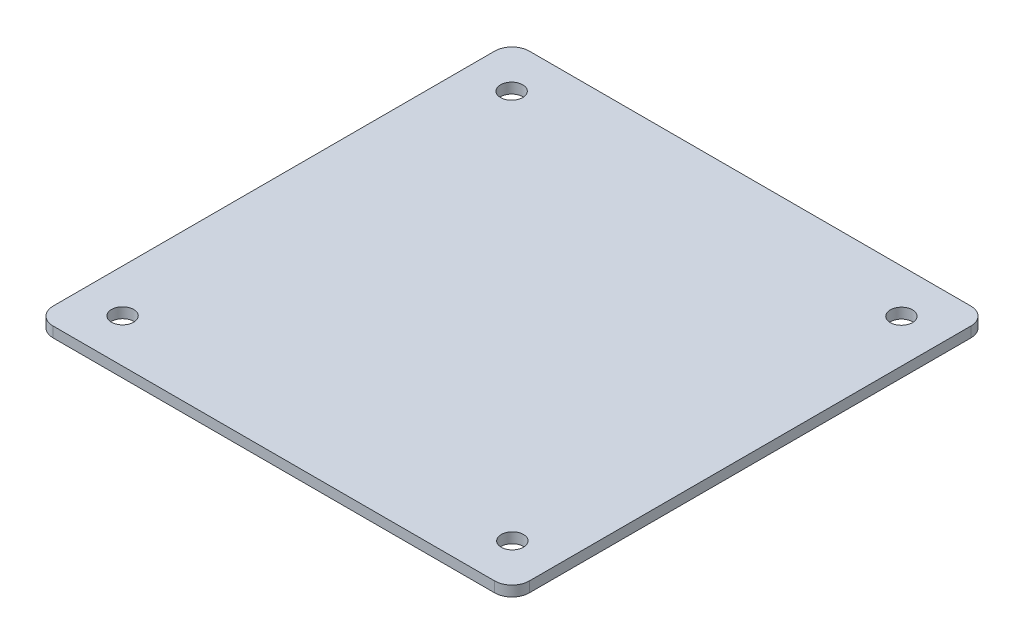
ISO-10303-21;
HEADER;
FILE_DESCRIPTION(('STEP AP214'),'2;1');
FILE_NAME('part.step','',(''),(''),'','','');
FILE_SCHEMA(('AUTOMOTIVE_DESIGN { 1 0 10303 214 1 1 1 1 }'));
ENDSEC;
DATA;
#1=APPLICATION_CONTEXT('core data for automotive mechanical design processes');
#2=APPLICATION_PROTOCOL_DEFINITION('international standard','automotive_design',2000,#1);
#3=PRODUCT_CONTEXT('',#1,'mechanical');
#4=PRODUCT('Part','Part','',(#3));
#5=PRODUCT_RELATED_PRODUCT_CATEGORY('part','',(#4));
#6=PRODUCT_DEFINITION_FORMATION('','',#4);
#7=PRODUCT_DEFINITION_CONTEXT('part definition',#1,'design');
#8=PRODUCT_DEFINITION('design','',#6,#7);
#9=PRODUCT_DEFINITION_SHAPE('','',#8);
#10=(LENGTH_UNIT() NAMED_UNIT(*) SI_UNIT(.MILLI.,.METRE.));
#11=(NAMED_UNIT(*) PLANE_ANGLE_UNIT() SI_UNIT($,.RADIAN.));
#12=(NAMED_UNIT(*) SI_UNIT($,.STERADIAN.) SOLID_ANGLE_UNIT());
#13=UNCERTAINTY_MEASURE_WITH_UNIT(LENGTH_MEASURE(1.E-05),#10,'distance_accuracy_value','');
#14=(GEOMETRIC_REPRESENTATION_CONTEXT(3) GLOBAL_UNCERTAINTY_ASSIGNED_CONTEXT((#13)) GLOBAL_UNIT_ASSIGNED_CONTEXT((#10,
#11,#12)) REPRESENTATION_CONTEXT('',''));
#15=CARTESIAN_POINT('',(0.,0.,0.));
#16=DIRECTION('',(0.,0.,1.));
#17=DIRECTION('',(1.,0.,0.));
#18=AXIS2_PLACEMENT_3D('',#15,#16,#17);
#19=CARTESIAN_POINT('',(0.,1.524,0.));
#20=DIRECTION('',(0.,-1.,0.));
#21=DIRECTION('',(0.,0.,-1.));
#22=AXIS2_PLACEMENT_3D('',#19,#20,#21);
#23=PLANE('',#22);
#24=DIRECTION('',(1.,0.,0.));
#25=VECTOR('',#24,1.);
#26=CARTESIAN_POINT('',(0.499999999999987,1.524,14.5));
#27=LINE('',#26,#25);
#28=CARTESIAN_POINT('',(3.03999999999999,1.524,14.5));
#29=VERTEX_POINT('',#28);
#30=CARTESIAN_POINT('',(67.96,1.524,14.5));
#31=VERTEX_POINT('',#30);
#32=EDGE_CURVE('E168',#29,#31,#27,.T.);
#33=ORIENTED_EDGE('',*,*,#32,.T.);
#34=CARTESIAN_POINT('',(67.96,1.524,11.96));
#35=DIRECTION('',(0.,-1.,0.));
#36=DIRECTION('',(0.,0.,-1.));
#37=AXIS2_PLACEMENT_3D('',#34,#35,#36);
#38=CIRCLE('',#37,2.54);
#39=CARTESIAN_POINT('',(70.5,1.524,11.96));
#40=VERTEX_POINT('',#39);
#41=EDGE_CURVE('E149',#31,#40,#38,.F.);
#42=ORIENTED_EDGE('',*,*,#41,.T.);
#43=DIRECTION('',(0.,0.,-1.));
#44=VECTOR('',#43,1.);
#45=CARTESIAN_POINT('',(70.5,1.524,14.5));
#46=LINE('',#45,#44);
#47=CARTESIAN_POINT('',(70.5,1.524,-52.96));
#48=VERTEX_POINT('',#47);
#49=EDGE_CURVE('E119',#40,#48,#46,.T.);
#50=ORIENTED_EDGE('',*,*,#49,.T.);
#51=CARTESIAN_POINT('',(67.96,1.524,-52.96));
#52=DIRECTION('',(0.,-1.,0.));
#53=DIRECTION('',(0.,0.,-1.));
#54=AXIS2_PLACEMENT_3D('',#51,#52,#53);
#55=CIRCLE('',#54,2.54);
#56=CARTESIAN_POINT('',(67.96,1.524,-55.5));
#57=VERTEX_POINT('',#56);
#58=EDGE_CURVE('E55',#48,#57,#55,.F.);
#59=ORIENTED_EDGE('',*,*,#58,.T.);
#60=DIRECTION('',(-1.,0.,0.));
#61=VECTOR('',#60,1.);
#62=CARTESIAN_POINT('',(0.499999999999987,1.524,-55.5));
#63=LINE('',#62,#61);
#64=CARTESIAN_POINT('',(3.03999999999999,1.524,-55.5));
#65=VERTEX_POINT('',#64);
#66=EDGE_CURVE('E135',#57,#65,#63,.T.);
#67=ORIENTED_EDGE('',*,*,#66,.T.);
#68=CARTESIAN_POINT('',(3.03999999999999,1.524,-52.96));
#69=DIRECTION('',(0.,-1.,0.));
#70=DIRECTION('',(0.,0.,-1.));
#71=AXIS2_PLACEMENT_3D('',#68,#69,#70);
#72=CIRCLE('',#71,2.54);
#73=CARTESIAN_POINT('',(0.499999999999987,1.524,-52.96));
#74=VERTEX_POINT('',#73);
#75=EDGE_CURVE('E146',#65,#74,#72,.F.);
#76=ORIENTED_EDGE('',*,*,#75,.T.);
#77=DIRECTION('',(0.,0.,1.));
#78=VECTOR('',#77,1.);
#79=CARTESIAN_POINT('',(0.499999999999987,1.524,14.5));
#80=LINE('',#79,#78);
#81=CARTESIAN_POINT('',(0.499999999999987,1.524,11.96));
#82=VERTEX_POINT('',#81);
#83=EDGE_CURVE('E129',#74,#82,#80,.T.);
#84=ORIENTED_EDGE('',*,*,#83,.T.);
#85=CARTESIAN_POINT('',(3.03999999999999,1.524,11.96));
#86=DIRECTION('',(0.,-1.,0.));
#87=DIRECTION('',(0.,0.,-1.));
#88=AXIS2_PLACEMENT_3D('',#85,#86,#87);
#89=CIRCLE('',#88,2.54);
#90=EDGE_CURVE('E144',#82,#29,#89,.F.);
#91=ORIENTED_EDGE('',*,*,#90,.T.);
#92=EDGE_LOOP('',(#33,#42,#50,#59,#67,#76,#84,#91));
#93=FACE_BOUND('',#92,.T.);
#94=CARTESIAN_POINT('',(6.84999999999999,1.524,-49.0980587750252));
#95=DIRECTION('',(0.,1.,0.));
#96=DIRECTION('',(0.,0.,1.));
#97=AXIS2_PLACEMENT_3D('',#94,#95,#96);
#98=CIRCLE('',#97,1.63195);
#99=CARTESIAN_POINT('',(6.84999999999999,1.524,-50.7300087750252));
#100=VERTEX_POINT('',#99);
#101=EDGE_CURVE('E173',#100,#100,#98,.T.);
#102=ORIENTED_EDGE('',*,*,#101,.F.);
#103=EDGE_LOOP('',(#102));
#104=FACE_BOUND('',#103,.T.);
#105=CARTESIAN_POINT('',(6.84999999999999,1.524,8.09805877502521));
#106=DIRECTION('',(0.,1.,0.));
#107=DIRECTION('',(0.,0.,-1.));
#108=AXIS2_PLACEMENT_3D('',#105,#106,#107);
#109=CIRCLE('',#108,1.63195);
#110=CARTESIAN_POINT('',(6.84999999999999,1.524,6.46610877502521));
#111=VERTEX_POINT('',#110);
#112=EDGE_CURVE('E182',#111,#111,#109,.T.);
#113=ORIENTED_EDGE('',*,*,#112,.F.);
#114=EDGE_LOOP('',(#113));
#115=FACE_BOUND('',#114,.T.);
#116=CARTESIAN_POINT('',(64.15,1.524,8.09805877502521));
#117=DIRECTION('',(0.,1.,0.));
#118=DIRECTION('',(0.,0.,1.));
#119=AXIS2_PLACEMENT_3D('',#116,#117,#118);
#120=CIRCLE('',#119,1.63194999999999);
#121=CARTESIAN_POINT('',(64.15,1.524,6.46610877502522));
#122=VERTEX_POINT('',#121);
#123=EDGE_CURVE('E187',#122,#122,#120,.T.);
#124=ORIENTED_EDGE('',*,*,#123,.F.);
#125=EDGE_LOOP('',(#124));
#126=FACE_BOUND('',#125,.T.);
#127=CARTESIAN_POINT('',(64.15,1.524,-49.0980587750252));
#128=DIRECTION('',(0.,1.,0.));
#129=DIRECTION('',(0.,0.,-1.));
#130=AXIS2_PLACEMENT_3D('',#127,#128,#129);
#131=CIRCLE('',#130,1.63194999999999);
#132=CARTESIAN_POINT('',(64.15,1.524,-50.7300087750252));
#133=VERTEX_POINT('',#132);
#134=EDGE_CURVE('E193',#133,#133,#131,.T.);
#135=ORIENTED_EDGE('',*,*,#134,.F.);
#136=EDGE_LOOP('',(#135));
#137=FACE_BOUND('',#136,.T.);
#138=ADVANCED_FACE('F33',(#93,#104,#115,#126,#137),#23,.F.);
#139=CARTESIAN_POINT('',(0.,0.,0.));
#140=DIRECTION('',(0.,-1.,0.));
#141=DIRECTION('',(0.,0.,-1.));
#142=AXIS2_PLACEMENT_3D('',#139,#140,#141);
#143=PLANE('',#142);
#144=CARTESIAN_POINT('',(64.15,0.,8.09805877502521));
#145=DIRECTION('',(0.,1.,0.));
#146=DIRECTION('',(0.,0.,1.));
#147=AXIS2_PLACEMENT_3D('',#144,#145,#146);
#148=CIRCLE('',#147,1.63194999999999);
#149=CARTESIAN_POINT('',(64.15,0.,6.46610877502522));
#150=VERTEX_POINT('',#149);
#151=EDGE_CURVE('E190',#150,#150,#148,.T.);
#152=ORIENTED_EDGE('',*,*,#151,.T.);
#153=EDGE_LOOP('',(#152));
#154=FACE_BOUND('',#153,.T.);
#155=CARTESIAN_POINT('',(6.84999999999999,0.,-49.0980587750252));
#156=DIRECTION('',(0.,1.,0.));
#157=DIRECTION('',(0.,0.,1.));
#158=AXIS2_PLACEMENT_3D('',#155,#156,#157);
#159=CIRCLE('',#158,1.63195);
#160=CARTESIAN_POINT('',(6.84999999999999,0.,-50.7300087750252));
#161=VERTEX_POINT('',#160);
#162=EDGE_CURVE('E175',#161,#161,#159,.T.);
#163=ORIENTED_EDGE('',*,*,#162,.T.);
#164=EDGE_LOOP('',(#163));
#165=FACE_BOUND('',#164,.T.);
#166=DIRECTION('',(0.,0.,-1.));
#167=VECTOR('',#166,1.);
#168=CARTESIAN_POINT('',(70.5,0.,14.5));
#169=LINE('',#168,#167);
#170=CARTESIAN_POINT('',(70.5,0.,11.96));
#171=VERTEX_POINT('',#170);
#172=CARTESIAN_POINT('',(70.5,0.,-52.96));
#173=VERTEX_POINT('',#172);
#174=EDGE_CURVE('E117',#171,#173,#169,.T.);
#175=ORIENTED_EDGE('',*,*,#174,.F.);
#176=CARTESIAN_POINT('',(67.96,0.,11.96));
#177=DIRECTION('',(0.,-1.,0.));
#178=DIRECTION('',(0.,0.,-1.));
#179=AXIS2_PLACEMENT_3D('',#176,#177,#178);
#180=CIRCLE('',#179,2.54);
#181=CARTESIAN_POINT('',(67.96,0.,14.5));
#182=VERTEX_POINT('',#181);
#183=EDGE_CURVE('E100',#171,#182,#180,.T.);
#184=ORIENTED_EDGE('',*,*,#183,.T.);
#185=DIRECTION('',(1.,0.,0.));
#186=VECTOR('',#185,1.);
#187=CARTESIAN_POINT('',(0.499999999999987,0.,14.5));
#188=LINE('',#187,#186);
#189=CARTESIAN_POINT('',(3.03999999999999,0.,14.5));
#190=VERTEX_POINT('',#189);
#191=EDGE_CURVE('E127',#190,#182,#188,.T.);
#192=ORIENTED_EDGE('',*,*,#191,.F.);
#193=CARTESIAN_POINT('',(3.03999999999999,0.,11.96));
#194=DIRECTION('',(0.,-1.,0.));
#195=DIRECTION('',(0.,0.,-1.));
#196=AXIS2_PLACEMENT_3D('',#193,#194,#195);
#197=CIRCLE('',#196,2.54);
#198=CARTESIAN_POINT('',(0.499999999999987,0.,11.96));
#199=VERTEX_POINT('',#198);
#200=EDGE_CURVE('E120',#190,#199,#197,.T.);
#201=ORIENTED_EDGE('',*,*,#200,.T.);
#202=DIRECTION('',(0.,0.,1.));
#203=VECTOR('',#202,1.);
#204=CARTESIAN_POINT('',(0.499999999999987,0.,14.5));
#205=LINE('',#204,#203);
#206=CARTESIAN_POINT('',(0.499999999999987,0.,-52.96));
#207=VERTEX_POINT('',#206);
#208=EDGE_CURVE('E131',#207,#199,#205,.T.);
#209=ORIENTED_EDGE('',*,*,#208,.F.);
#210=CARTESIAN_POINT('',(3.03999999999999,0.,-52.96));
#211=DIRECTION('',(0.,-1.,0.));
#212=DIRECTION('',(0.,0.,-1.));
#213=AXIS2_PLACEMENT_3D('',#210,#211,#212);
#214=CIRCLE('',#213,2.54);
#215=CARTESIAN_POINT('',(3.03999999999999,0.,-55.5));
#216=VERTEX_POINT('',#215);
#217=EDGE_CURVE('E138',#207,#216,#214,.T.);
#218=ORIENTED_EDGE('',*,*,#217,.T.);
#219=DIRECTION('',(-1.,0.,0.));
#220=VECTOR('',#219,1.);
#221=CARTESIAN_POINT('',(0.499999999999987,0.,-55.5));
#222=LINE('',#221,#220);
#223=CARTESIAN_POINT('',(67.96,0.,-55.5));
#224=VERTEX_POINT('',#223);
#225=EDGE_CURVE('E126',#224,#216,#222,.T.);
#226=ORIENTED_EDGE('',*,*,#225,.F.);
#227=CARTESIAN_POINT('',(67.96,0.,-52.96));
#228=DIRECTION('',(0.,-1.,0.));
#229=DIRECTION('',(0.,0.,-1.));
#230=AXIS2_PLACEMENT_3D('',#227,#228,#229);
#231=CIRCLE('',#230,2.54);
#232=EDGE_CURVE('E111',#224,#173,#231,.T.);
#233=ORIENTED_EDGE('',*,*,#232,.T.);
#234=EDGE_LOOP('',(#175,#184,#192,#201,#209,#218,#226,#233));
#235=FACE_BOUND('',#234,.T.);
#236=CARTESIAN_POINT('',(6.84999999999999,0.,8.09805877502521));
#237=DIRECTION('',(0.,1.,0.));
#238=DIRECTION('',(0.,0.,-1.));
#239=AXIS2_PLACEMENT_3D('',#236,#237,#238);
#240=CIRCLE('',#239,1.63195);
#241=CARTESIAN_POINT('',(6.84999999999999,0.,6.46610877502521));
#242=VERTEX_POINT('',#241);
#243=EDGE_CURVE('E184',#242,#242,#240,.T.);
#244=ORIENTED_EDGE('',*,*,#243,.T.);
#245=EDGE_LOOP('',(#244));
#246=FACE_BOUND('',#245,.T.);
#247=CARTESIAN_POINT('',(64.15,0.,-49.0980587750252));
#248=DIRECTION('',(0.,1.,0.));
#249=DIRECTION('',(0.,0.,-1.));
#250=AXIS2_PLACEMENT_3D('',#247,#248,#249);
#251=CIRCLE('',#250,1.63194999999999);
#252=CARTESIAN_POINT('',(64.15,0.,-50.7300087750252));
#253=VERTEX_POINT('',#252);
#254=EDGE_CURVE('E196',#253,#253,#251,.T.);
#255=ORIENTED_EDGE('',*,*,#254,.T.);
#256=EDGE_LOOP('',(#255));
#257=FACE_BOUND('',#256,.T.);
#258=ADVANCED_FACE('F123',(#154,#165,#235,#246,#257),#143,.T.);
#259=CARTESIAN_POINT('',(0.499999999999987,1.524,14.5));
#260=DIRECTION('',(1.,0.,0.));
#261=DIRECTION('',(0.,0.,-1.));
#262=AXIS2_PLACEMENT_3D('',#259,#260,#261);
#263=PLANE('',#262);
#264=ORIENTED_EDGE('',*,*,#83,.F.);
#265=DIRECTION('',(0.,-1.,0.));
#266=VECTOR('',#265,1.);
#267=CARTESIAN_POINT('',(0.499999999999987,1.524,-52.96));
#268=LINE('',#267,#266);
#269=EDGE_CURVE('E11',#74,#207,#268,.T.);
#270=ORIENTED_EDGE('',*,*,#269,.T.);
#271=ORIENTED_EDGE('',*,*,#208,.T.);
#272=DIRECTION('',(0.,-1.,0.));
#273=VECTOR('',#272,1.);
#274=CARTESIAN_POINT('',(0.499999999999987,1.524,11.96));
#275=LINE('',#274,#273);
#276=EDGE_CURVE('E41',#199,#82,#275,.F.);
#277=ORIENTED_EDGE('',*,*,#276,.T.);
#278=EDGE_LOOP('',(#264,#270,#271,#277));
#279=FACE_BOUND('',#278,.T.);
#280=ADVANCED_FACE('F159',(#279),#263,.F.);
#281=CARTESIAN_POINT('',(0.499999999999987,1.524,14.5));
#282=DIRECTION('',(0.,0.,-1.));
#283=DIRECTION('',(-1.,0.,0.));
#284=AXIS2_PLACEMENT_3D('',#281,#282,#283);
#285=PLANE('',#284);
#286=ORIENTED_EDGE('',*,*,#191,.T.);
#287=DIRECTION('',(0.,-1.,0.));
#288=VECTOR('',#287,1.);
#289=CARTESIAN_POINT('',(67.96,1.524,14.5));
#290=LINE('',#289,#288);
#291=EDGE_CURVE('E105',#182,#31,#290,.F.);
#292=ORIENTED_EDGE('',*,*,#291,.T.);
#293=ORIENTED_EDGE('',*,*,#32,.F.);
#294=DIRECTION('',(0.,-1.,0.));
#295=VECTOR('',#294,1.);
#296=CARTESIAN_POINT('',(3.03999999999999,1.524,14.5));
#297=LINE('',#296,#295);
#298=EDGE_CURVE('E110',#29,#190,#297,.T.);
#299=ORIENTED_EDGE('',*,*,#298,.T.);
#300=EDGE_LOOP('',(#286,#292,#293,#299));
#301=FACE_BOUND('',#300,.T.);
#302=ADVANCED_FACE('F172',(#301),#285,.F.);
#303=CARTESIAN_POINT('',(70.5,1.524,14.5));
#304=DIRECTION('',(-1.,0.,0.));
#305=DIRECTION('',(0.,0.,1.));
#306=AXIS2_PLACEMENT_3D('',#303,#304,#305);
#307=PLANE('',#306);
#308=ORIENTED_EDGE('',*,*,#49,.F.);
#309=DIRECTION('',(0.,-1.,0.));
#310=VECTOR('',#309,1.);
#311=CARTESIAN_POINT('',(70.5,1.524,11.96));
#312=LINE('',#311,#310);
#313=EDGE_CURVE('E104',#40,#171,#312,.T.);
#314=ORIENTED_EDGE('',*,*,#313,.T.);
#315=ORIENTED_EDGE('',*,*,#174,.T.);
#316=DIRECTION('',(0.,-1.,0.));
#317=VECTOR('',#316,1.);
#318=CARTESIAN_POINT('',(70.5,1.524,-52.96));
#319=LINE('',#318,#317);
#320=EDGE_CURVE('E121',#173,#48,#319,.F.);
#321=ORIENTED_EDGE('',*,*,#320,.T.);
#322=EDGE_LOOP('',(#308,#314,#315,#321));
#323=FACE_BOUND('',#322,.T.);
#324=ADVANCED_FACE('F116',(#323),#307,.F.);
#325=CARTESIAN_POINT('',(0.499999999999987,1.524,-55.5));
#326=DIRECTION('',(0.,0.,1.));
#327=DIRECTION('',(1.,0.,0.));
#328=AXIS2_PLACEMENT_3D('',#325,#326,#327);
#329=PLANE('',#328);
#330=ORIENTED_EDGE('',*,*,#66,.F.);
#331=DIRECTION('',(0.,-1.,0.));
#332=VECTOR('',#331,1.);
#333=CARTESIAN_POINT('',(67.96,1.524,-55.5));
#334=LINE('',#333,#332);
#335=EDGE_CURVE('E152',#57,#224,#334,.T.);
#336=ORIENTED_EDGE('',*,*,#335,.T.);
#337=ORIENTED_EDGE('',*,*,#225,.T.);
#338=DIRECTION('',(0.,-1.,0.));
#339=VECTOR('',#338,1.);
#340=CARTESIAN_POINT('',(3.03999999999999,1.524,-55.5));
#341=LINE('',#340,#339);
#342=EDGE_CURVE('E48',#216,#65,#341,.F.);
#343=ORIENTED_EDGE('',*,*,#342,.T.);
#344=EDGE_LOOP('',(#330,#336,#337,#343));
#345=FACE_BOUND('',#344,.T.);
#346=ADVANCED_FACE('F216',(#345),#329,.F.);
#347=CARTESIAN_POINT('',(6.84999999999999,1.524,-49.0980587750252));
#348=DIRECTION('',(0.,-1.,0.));
#349=DIRECTION('',(0.,0.,-1.));
#350=AXIS2_PLACEMENT_3D('',#347,#348,#349);
#351=CYLINDRICAL_SURFACE('',#350,1.63195);
#352=CARTESIAN_POINT('',(6.84999999999999,1.524,-50.7300087750252));
#353=CARTESIAN_POINT('',(6.84999999999999,1.508125,-50.7300087750252));
#354=CARTESIAN_POINT('',(6.84999999999999,1.49225,-50.7300087750252));
#355=CARTESIAN_POINT('',(6.84999999999999,1.4605,-50.7300087750252));
#356=CARTESIAN_POINT('',(6.84999999999999,1.444625,-50.7300087750252));
#357=CARTESIAN_POINT('',(6.84999999999999,1.412875,-50.7300087750252));
#358=CARTESIAN_POINT('',(6.84999999999999,1.397,-50.7300087750252));
#359=CARTESIAN_POINT('',(6.84999999999999,1.36525,-50.7300087750252));
#360=CARTESIAN_POINT('',(6.84999999999999,1.349375,-50.7300087750252));
#361=CARTESIAN_POINT('',(6.84999999999999,1.317625,-50.7300087750252));
#362=CARTESIAN_POINT('',(6.84999999999999,1.30175,-50.7300087750252));
#363=CARTESIAN_POINT('',(6.84999999999999,1.27,-50.7300087750252));
#364=CARTESIAN_POINT('',(6.84999999999999,1.254125,-50.7300087750252));
#365=CARTESIAN_POINT('',(6.84999999999999,1.222375,-50.7300087750252));
#366=CARTESIAN_POINT('',(6.84999999999999,1.2065,-50.7300087750252));
#367=CARTESIAN_POINT('',(6.84999999999999,1.17475,-50.7300087750252));
#368=CARTESIAN_POINT('',(6.84999999999999,1.158875,-50.7300087750252));
#369=CARTESIAN_POINT('',(6.84999999999999,1.127125,-50.7300087750252));
#370=CARTESIAN_POINT('',(6.84999999999999,1.11125,-50.7300087750252));
#371=CARTESIAN_POINT('',(6.84999999999999,1.0795,-50.7300087750252));
#372=CARTESIAN_POINT('',(6.84999999999999,1.063625,-50.7300087750252));
#373=CARTESIAN_POINT('',(6.84999999999999,1.031875,-50.7300087750252));
#374=CARTESIAN_POINT('',(6.84999999999999,1.016,-50.7300087750252));
#375=CARTESIAN_POINT('',(6.84999999999999,0.98425,-50.7300087750252));
#376=CARTESIAN_POINT('',(6.84999999999999,0.968375,-50.7300087750252));
#377=CARTESIAN_POINT('',(6.84999999999999,0.936625,-50.7300087750252));
#378=CARTESIAN_POINT('',(6.84999999999999,0.92075,-50.7300087750252));
#379=CARTESIAN_POINT('',(6.84999999999999,0.889,-50.7300087750252));
#380=CARTESIAN_POINT('',(6.84999999999999,0.873125,-50.7300087750252));
#381=CARTESIAN_POINT('',(6.84999999999999,0.841375,-50.7300087750252));
#382=CARTESIAN_POINT('',(6.84999999999999,0.8255,-50.7300087750252));
#383=CARTESIAN_POINT('',(6.84999999999999,0.79375,-50.7300087750252));
#384=CARTESIAN_POINT('',(6.84999999999999,0.777875,-50.7300087750252));
#385=CARTESIAN_POINT('',(6.84999999999999,0.746125,-50.7300087750252));
#386=CARTESIAN_POINT('',(6.84999999999999,0.73025,-50.7300087750252));
#387=CARTESIAN_POINT('',(6.84999999999999,0.6985,-50.7300087750252));
#388=CARTESIAN_POINT('',(6.84999999999999,0.682625,-50.7300087750252));
#389=CARTESIAN_POINT('',(6.84999999999999,0.650875,-50.7300087750252));
#390=CARTESIAN_POINT('',(6.84999999999999,0.635,-50.7300087750252));
#391=CARTESIAN_POINT('',(6.84999999999999,0.60325,-50.7300087750252));
#392=CARTESIAN_POINT('',(6.84999999999999,0.587375,-50.7300087750252));
#393=CARTESIAN_POINT('',(6.84999999999999,0.555625,-50.7300087750252));
#394=CARTESIAN_POINT('',(6.84999999999999,0.53975,-50.7300087750252));
#395=CARTESIAN_POINT('',(6.84999999999999,0.508,-50.7300087750252));
#396=CARTESIAN_POINT('',(6.84999999999999,0.492125,-50.7300087750252));
#397=CARTESIAN_POINT('',(6.84999999999999,0.460375,-50.7300087750252));
#398=CARTESIAN_POINT('',(6.84999999999999,0.4445,-50.7300087750252));
#399=CARTESIAN_POINT('',(6.84999999999999,0.41275,-50.7300087750252));
#400=CARTESIAN_POINT('',(6.84999999999999,0.396875,-50.7300087750252));
#401=CARTESIAN_POINT('',(6.84999999999999,0.365125,-50.7300087750252));
#402=CARTESIAN_POINT('',(6.84999999999999,0.34925,-50.7300087750252));
#403=CARTESIAN_POINT('',(6.84999999999999,0.3175,-50.7300087750252));
#404=CARTESIAN_POINT('',(6.84999999999999,0.301625,-50.7300087750252));
#405=CARTESIAN_POINT('',(6.84999999999999,0.269875,-50.7300087750252));
#406=CARTESIAN_POINT('',(6.84999999999999,0.254,-50.7300087750252));
#407=CARTESIAN_POINT('',(6.84999999999999,0.22225,-50.7300087750252));
#408=CARTESIAN_POINT('',(6.84999999999999,0.206375,-50.7300087750252));
#409=CARTESIAN_POINT('',(6.84999999999999,0.174625,-50.7300087750252));
#410=CARTESIAN_POINT('',(6.84999999999999,0.15875,-50.7300087750252));
#411=CARTESIAN_POINT('',(6.84999999999999,0.127,-50.7300087750252));
#412=CARTESIAN_POINT('',(6.84999999999999,0.111125,-50.7300087750252));
#413=CARTESIAN_POINT('',(6.84999999999999,0.079375,-50.7300087750252));
#414=CARTESIAN_POINT('',(6.84999999999999,0.0635,-50.7300087750252));
#415=CARTESIAN_POINT('',(6.84999999999999,0.0317499999999999,-50.7300087750252));
#416=CARTESIAN_POINT('',(6.84999999999999,0.015875,-50.7300087750252));
#417=CARTESIAN_POINT('',(6.84999999999999,0.,-50.7300087750252));
#418=B_SPLINE_CURVE_WITH_KNOTS('',3,(#352,#353,#354,#355,#356,#357,#358,#359,#360,#361,#362,
#363,#364,#365,#366,#367,#368,#369,#370,#371,#372,#373,#374,#375,#376,#377,#378,#379,#380,#381,
#382,#383,#384,#385,#386,#387,#388,#389,#390,#391,#392,#393,#394,#395,#396,#397,#398,#399,#400,
#401,#402,#403,#404,#405,#406,#407,#408,#409,#410,#411,#412,#413,#414,#415,#416,#417),
.UNSPECIFIED.,.F.,.F.,(4,2,2,2,2,2,2,2,2,2,2,2,2,2,2,2,2,2,2,2,2,2,2,2,2,2,2,2,2,2,2,2,4),(0.,
0.0476250000000001,0.0952500000000001,0.142875,0.1905,0.238125,0.28575,0.333375,0.381,0.428625,
0.47625,0.523875,0.5715,0.619125,0.66675,0.714375,0.762,0.809625,0.85725,0.904875,0.9525,
1.000125,1.04775,1.095375,1.143,1.190625,1.23825,1.285875,1.3335,1.381125,1.42875,1.476375,
1.524),.UNSPECIFIED.);
#419=EDGE_CURVE('BSEAM213',#100,#161,#418,.T.);
#420=ORIENTED_EDGE('',*,*,#101,.T.);
#421=ORIENTED_EDGE('',*,*,#162,.F.);
#422=ORIENTED_EDGE('',*,*,#419,.T.);
#423=ORIENTED_EDGE('',*,*,#419,.F.);
#424=EDGE_LOOP('',(#420,#422,#421,#423));
#425=FACE_BOUND('',#424,.T.);
#426=ADVANCED_FACE('F213',(#425),#351,.F.);
#427=CARTESIAN_POINT('',(6.84999999999999,1.524,8.09805877502521));
#428=DIRECTION('',(0.,-1.,0.));
#429=DIRECTION('',(0.,0.,-1.));
#430=AXIS2_PLACEMENT_3D('',#427,#428,#429);
#431=CYLINDRICAL_SURFACE('',#430,1.63195);
#432=CARTESIAN_POINT('',(6.84999999999999,1.524,6.46610877502521));
#433=CARTESIAN_POINT('',(6.84999999999999,1.508125,6.46610877502521));
#434=CARTESIAN_POINT('',(6.84999999999999,1.49225,6.46610877502521));
#435=CARTESIAN_POINT('',(6.84999999999999,1.4605,6.46610877502521));
#436=CARTESIAN_POINT('',(6.84999999999999,1.444625,6.46610877502521));
#437=CARTESIAN_POINT('',(6.84999999999999,1.412875,6.46610877502521));
#438=CARTESIAN_POINT('',(6.84999999999999,1.397,6.46610877502521));
#439=CARTESIAN_POINT('',(6.84999999999999,1.36525,6.46610877502521));
#440=CARTESIAN_POINT('',(6.84999999999999,1.349375,6.46610877502521));
#441=CARTESIAN_POINT('',(6.84999999999999,1.317625,6.46610877502521));
#442=CARTESIAN_POINT('',(6.84999999999999,1.30175,6.46610877502521));
#443=CARTESIAN_POINT('',(6.84999999999999,1.27,6.46610877502521));
#444=CARTESIAN_POINT('',(6.84999999999999,1.254125,6.46610877502521));
#445=CARTESIAN_POINT('',(6.84999999999999,1.222375,6.46610877502521));
#446=CARTESIAN_POINT('',(6.84999999999999,1.2065,6.46610877502521));
#447=CARTESIAN_POINT('',(6.84999999999999,1.17475,6.46610877502521));
#448=CARTESIAN_POINT('',(6.84999999999999,1.158875,6.46610877502521));
#449=CARTESIAN_POINT('',(6.84999999999999,1.127125,6.46610877502521));
#450=CARTESIAN_POINT('',(6.84999999999999,1.11125,6.46610877502521));
#451=CARTESIAN_POINT('',(6.84999999999999,1.0795,6.46610877502521));
#452=CARTESIAN_POINT('',(6.84999999999999,1.063625,6.46610877502521));
#453=CARTESIAN_POINT('',(6.84999999999999,1.031875,6.46610877502521));
#454=CARTESIAN_POINT('',(6.84999999999999,1.016,6.46610877502521));
#455=CARTESIAN_POINT('',(6.84999999999999,0.98425,6.46610877502521));
#456=CARTESIAN_POINT('',(6.84999999999999,0.968375,6.46610877502521));
#457=CARTESIAN_POINT('',(6.84999999999999,0.936625,6.46610877502521));
#458=CARTESIAN_POINT('',(6.84999999999999,0.92075,6.46610877502521));
#459=CARTESIAN_POINT('',(6.84999999999999,0.889,6.46610877502521));
#460=CARTESIAN_POINT('',(6.84999999999999,0.873125,6.46610877502521));
#461=CARTESIAN_POINT('',(6.84999999999999,0.841375,6.46610877502521));
#462=CARTESIAN_POINT('',(6.84999999999999,0.8255,6.46610877502521));
#463=CARTESIAN_POINT('',(6.84999999999999,0.79375,6.46610877502521));
#464=CARTESIAN_POINT('',(6.84999999999999,0.777875,6.46610877502521));
#465=CARTESIAN_POINT('',(6.84999999999999,0.746125,6.46610877502521));
#466=CARTESIAN_POINT('',(6.84999999999999,0.73025,6.46610877502521));
#467=CARTESIAN_POINT('',(6.84999999999999,0.6985,6.46610877502521));
#468=CARTESIAN_POINT('',(6.84999999999999,0.682625,6.46610877502521));
#469=CARTESIAN_POINT('',(6.84999999999999,0.650875,6.46610877502521));
#470=CARTESIAN_POINT('',(6.84999999999999,0.635,6.46610877502521));
#471=CARTESIAN_POINT('',(6.84999999999999,0.60325,6.46610877502521));
#472=CARTESIAN_POINT('',(6.84999999999999,0.587375,6.46610877502521));
#473=CARTESIAN_POINT('',(6.84999999999999,0.555625,6.46610877502521));
#474=CARTESIAN_POINT('',(6.84999999999999,0.53975,6.46610877502521));
#475=CARTESIAN_POINT('',(6.84999999999999,0.508,6.46610877502521));
#476=CARTESIAN_POINT('',(6.84999999999999,0.492125,6.46610877502521));
#477=CARTESIAN_POINT('',(6.84999999999999,0.460375,6.46610877502521));
#478=CARTESIAN_POINT('',(6.84999999999999,0.4445,6.46610877502521));
#479=CARTESIAN_POINT('',(6.84999999999999,0.41275,6.46610877502521));
#480=CARTESIAN_POINT('',(6.84999999999999,0.396875,6.46610877502521));
#481=CARTESIAN_POINT('',(6.84999999999999,0.365125,6.46610877502521));
#482=CARTESIAN_POINT('',(6.84999999999999,0.34925,6.46610877502521));
#483=CARTESIAN_POINT('',(6.84999999999999,0.3175,6.46610877502521));
#484=CARTESIAN_POINT('',(6.84999999999999,0.301625,6.46610877502521));
#485=CARTESIAN_POINT('',(6.84999999999999,0.269875,6.46610877502521));
#486=CARTESIAN_POINT('',(6.84999999999999,0.254,6.46610877502521));
#487=CARTESIAN_POINT('',(6.84999999999999,0.22225,6.46610877502521));
#488=CARTESIAN_POINT('',(6.84999999999999,0.206375,6.46610877502521));
#489=CARTESIAN_POINT('',(6.84999999999999,0.174625,6.46610877502521));
#490=CARTESIAN_POINT('',(6.84999999999999,0.15875,6.46610877502521));
#491=CARTESIAN_POINT('',(6.84999999999999,0.127,6.46610877502521));
#492=CARTESIAN_POINT('',(6.84999999999999,0.111125,6.46610877502521));
#493=CARTESIAN_POINT('',(6.84999999999999,0.079375,6.46610877502521));
#494=CARTESIAN_POINT('',(6.84999999999999,0.0635,6.46610877502521));
#495=CARTESIAN_POINT('',(6.84999999999999,0.0317499999999999,6.46610877502521));
#496=CARTESIAN_POINT('',(6.84999999999999,0.015875,6.46610877502521));
#497=CARTESIAN_POINT('',(6.84999999999999,0.,6.46610877502521));
#498=B_SPLINE_CURVE_WITH_KNOTS('',3,(#432,#433,#434,#435,#436,#437,#438,#439,#440,#441,#442,
#443,#444,#445,#446,#447,#448,#449,#450,#451,#452,#453,#454,#455,#456,#457,#458,#459,#460,#461,
#462,#463,#464,#465,#466,#467,#468,#469,#470,#471,#472,#473,#474,#475,#476,#477,#478,#479,#480,
#481,#482,#483,#484,#485,#486,#487,#488,#489,#490,#491,#492,#493,#494,#495,#496,#497),
.UNSPECIFIED.,.F.,.F.,(4,2,2,2,2,2,2,2,2,2,2,2,2,2,2,2,2,2,2,2,2,2,2,2,2,2,2,2,2,2,2,2,4),(0.,
0.0476250000000001,0.0952500000000001,0.142875,0.1905,0.238125,0.28575,0.333375,0.381,0.428625,
0.47625,0.523875,0.5715,0.619125,0.66675,0.714375,0.762,0.809625,0.85725,0.904875,0.9525,
1.000125,1.04775,1.095375,1.143,1.190625,1.23825,1.285875,1.3335,1.381125,1.42875,1.476375,
1.524),.UNSPECIFIED.);
#499=EDGE_CURVE('BSEAM308',#111,#242,#498,.T.);
#500=ORIENTED_EDGE('',*,*,#112,.T.);
#501=ORIENTED_EDGE('',*,*,#243,.F.);
#502=ORIENTED_EDGE('',*,*,#499,.T.);
#503=ORIENTED_EDGE('',*,*,#499,.F.);
#504=EDGE_LOOP('',(#500,#502,#501,#503));
#505=FACE_BOUND('',#504,.T.);
#506=ADVANCED_FACE('F308',(#505),#431,.F.);
#507=CARTESIAN_POINT('',(64.15,1.524,8.09805877502521));
#508=DIRECTION('',(0.,-1.,0.));
#509=DIRECTION('',(0.,0.,-1.));
#510=AXIS2_PLACEMENT_3D('',#507,#508,#509);
#511=CYLINDRICAL_SURFACE('',#510,1.63194999999999);
#512=CARTESIAN_POINT('',(64.15,1.524,6.46610877502522));
#513=CARTESIAN_POINT('',(64.15,1.508125,6.46610877502522));
#514=CARTESIAN_POINT('',(64.15,1.49225,6.46610877502522));
#515=CARTESIAN_POINT('',(64.15,1.4605,6.46610877502522));
#516=CARTESIAN_POINT('',(64.15,1.444625,6.46610877502522));
#517=CARTESIAN_POINT('',(64.15,1.412875,6.46610877502522));
#518=CARTESIAN_POINT('',(64.15,1.397,6.46610877502522));
#519=CARTESIAN_POINT('',(64.15,1.36525,6.46610877502522));
#520=CARTESIAN_POINT('',(64.15,1.349375,6.46610877502522));
#521=CARTESIAN_POINT('',(64.15,1.317625,6.46610877502522));
#522=CARTESIAN_POINT('',(64.15,1.30175,6.46610877502522));
#523=CARTESIAN_POINT('',(64.15,1.27,6.46610877502522));
#524=CARTESIAN_POINT('',(64.15,1.254125,6.46610877502522));
#525=CARTESIAN_POINT('',(64.15,1.222375,6.46610877502522));
#526=CARTESIAN_POINT('',(64.15,1.2065,6.46610877502522));
#527=CARTESIAN_POINT('',(64.15,1.17475,6.46610877502522));
#528=CARTESIAN_POINT('',(64.15,1.158875,6.46610877502522));
#529=CARTESIAN_POINT('',(64.15,1.127125,6.46610877502522));
#530=CARTESIAN_POINT('',(64.15,1.11125,6.46610877502522));
#531=CARTESIAN_POINT('',(64.15,1.0795,6.46610877502522));
#532=CARTESIAN_POINT('',(64.15,1.063625,6.46610877502522));
#533=CARTESIAN_POINT('',(64.15,1.031875,6.46610877502522));
#534=CARTESIAN_POINT('',(64.15,1.016,6.46610877502522));
#535=CARTESIAN_POINT('',(64.15,0.98425,6.46610877502522));
#536=CARTESIAN_POINT('',(64.15,0.968375,6.46610877502522));
#537=CARTESIAN_POINT('',(64.15,0.936625,6.46610877502522));
#538=CARTESIAN_POINT('',(64.15,0.92075,6.46610877502522));
#539=CARTESIAN_POINT('',(64.15,0.889,6.46610877502522));
#540=CARTESIAN_POINT('',(64.15,0.873125,6.46610877502522));
#541=CARTESIAN_POINT('',(64.15,0.841375,6.46610877502522));
#542=CARTESIAN_POINT('',(64.15,0.8255,6.46610877502522));
#543=CARTESIAN_POINT('',(64.15,0.79375,6.46610877502522));
#544=CARTESIAN_POINT('',(64.15,0.777875,6.46610877502522));
#545=CARTESIAN_POINT('',(64.15,0.746125,6.46610877502522));
#546=CARTESIAN_POINT('',(64.15,0.73025,6.46610877502522));
#547=CARTESIAN_POINT('',(64.15,0.6985,6.46610877502522));
#548=CARTESIAN_POINT('',(64.15,0.682625,6.46610877502522));
#549=CARTESIAN_POINT('',(64.15,0.650875,6.46610877502522));
#550=CARTESIAN_POINT('',(64.15,0.635,6.46610877502522));
#551=CARTESIAN_POINT('',(64.15,0.60325,6.46610877502522));
#552=CARTESIAN_POINT('',(64.15,0.587375,6.46610877502522));
#553=CARTESIAN_POINT('',(64.15,0.555625,6.46610877502522));
#554=CARTESIAN_POINT('',(64.15,0.53975,6.46610877502522));
#555=CARTESIAN_POINT('',(64.15,0.508,6.46610877502522));
#556=CARTESIAN_POINT('',(64.15,0.492125,6.46610877502522));
#557=CARTESIAN_POINT('',(64.15,0.460375,6.46610877502522));
#558=CARTESIAN_POINT('',(64.15,0.4445,6.46610877502522));
#559=CARTESIAN_POINT('',(64.15,0.41275,6.46610877502522));
#560=CARTESIAN_POINT('',(64.15,0.396875,6.46610877502522));
#561=CARTESIAN_POINT('',(64.15,0.365125,6.46610877502522));
#562=CARTESIAN_POINT('',(64.15,0.34925,6.46610877502522));
#563=CARTESIAN_POINT('',(64.15,0.3175,6.46610877502522));
#564=CARTESIAN_POINT('',(64.15,0.301625,6.46610877502522));
#565=CARTESIAN_POINT('',(64.15,0.269875,6.46610877502522));
#566=CARTESIAN_POINT('',(64.15,0.254,6.46610877502522));
#567=CARTESIAN_POINT('',(64.15,0.22225,6.46610877502522));
#568=CARTESIAN_POINT('',(64.15,0.206375,6.46610877502522));
#569=CARTESIAN_POINT('',(64.15,0.174625,6.46610877502522));
#570=CARTESIAN_POINT('',(64.15,0.15875,6.46610877502522));
#571=CARTESIAN_POINT('',(64.15,0.127,6.46610877502522));
#572=CARTESIAN_POINT('',(64.15,0.111125,6.46610877502522));
#573=CARTESIAN_POINT('',(64.15,0.079375,6.46610877502522));
#574=CARTESIAN_POINT('',(64.15,0.0635,6.46610877502522));
#575=CARTESIAN_POINT('',(64.15,0.0317499999999999,6.46610877502522));
#576=CARTESIAN_POINT('',(64.15,0.015875,6.46610877502522));
#577=CARTESIAN_POINT('',(64.15,0.,6.46610877502522));
#578=B_SPLINE_CURVE_WITH_KNOTS('',3,(#512,#513,#514,#515,#516,#517,#518,#519,#520,#521,#522,
#523,#524,#525,#526,#527,#528,#529,#530,#531,#532,#533,#534,#535,#536,#537,#538,#539,#540,#541,
#542,#543,#544,#545,#546,#547,#548,#549,#550,#551,#552,#553,#554,#555,#556,#557,#558,#559,#560,
#561,#562,#563,#564,#565,#566,#567,#568,#569,#570,#571,#572,#573,#574,#575,#576,#577),
.UNSPECIFIED.,.F.,.F.,(4,2,2,2,2,2,2,2,2,2,2,2,2,2,2,2,2,2,2,2,2,2,2,2,2,2,2,2,2,2,2,2,4),(0.,
0.0476250000000001,0.0952500000000001,0.142875,0.1905,0.238125,0.28575,0.333375,0.381,0.428625,
0.47625,0.523875,0.5715,0.619125,0.66675,0.714375,0.762,0.809625,0.85725,0.904875,0.9525,
1.000125,1.04775,1.095375,1.143,1.190625,1.23825,1.285875,1.3335,1.381125,1.42875,1.476375,
1.524),.UNSPECIFIED.);
#579=EDGE_CURVE('BSEAM299',#122,#150,#578,.T.);
#580=ORIENTED_EDGE('',*,*,#123,.T.);
#581=ORIENTED_EDGE('',*,*,#151,.F.);
#582=ORIENTED_EDGE('',*,*,#579,.T.);
#583=ORIENTED_EDGE('',*,*,#579,.F.);
#584=EDGE_LOOP('',(#580,#582,#581,#583));
#585=FACE_BOUND('',#584,.T.);
#586=ADVANCED_FACE('F299',(#585),#511,.F.);
#587=CARTESIAN_POINT('',(64.15,1.524,-49.0980587750252));
#588=DIRECTION('',(0.,-1.,0.));
#589=DIRECTION('',(0.,0.,-1.));
#590=AXIS2_PLACEMENT_3D('',#587,#588,#589);
#591=CYLINDRICAL_SURFACE('',#590,1.63194999999999);
#592=CARTESIAN_POINT('',(64.15,1.524,-50.7300087750252));
#593=CARTESIAN_POINT('',(64.15,1.508125,-50.7300087750252));
#594=CARTESIAN_POINT('',(64.15,1.49225,-50.7300087750252));
#595=CARTESIAN_POINT('',(64.15,1.4605,-50.7300087750252));
#596=CARTESIAN_POINT('',(64.15,1.444625,-50.7300087750252));
#597=CARTESIAN_POINT('',(64.15,1.412875,-50.7300087750252));
#598=CARTESIAN_POINT('',(64.15,1.397,-50.7300087750252));
#599=CARTESIAN_POINT('',(64.15,1.36525,-50.7300087750252));
#600=CARTESIAN_POINT('',(64.15,1.349375,-50.7300087750252));
#601=CARTESIAN_POINT('',(64.15,1.317625,-50.7300087750252));
#602=CARTESIAN_POINT('',(64.15,1.30175,-50.7300087750252));
#603=CARTESIAN_POINT('',(64.15,1.27,-50.7300087750252));
#604=CARTESIAN_POINT('',(64.15,1.254125,-50.7300087750252));
#605=CARTESIAN_POINT('',(64.15,1.222375,-50.7300087750252));
#606=CARTESIAN_POINT('',(64.15,1.2065,-50.7300087750252));
#607=CARTESIAN_POINT('',(64.15,1.17475,-50.7300087750252));
#608=CARTESIAN_POINT('',(64.15,1.158875,-50.7300087750252));
#609=CARTESIAN_POINT('',(64.15,1.127125,-50.7300087750252));
#610=CARTESIAN_POINT('',(64.15,1.11125,-50.7300087750252));
#611=CARTESIAN_POINT('',(64.15,1.0795,-50.7300087750252));
#612=CARTESIAN_POINT('',(64.15,1.063625,-50.7300087750252));
#613=CARTESIAN_POINT('',(64.15,1.031875,-50.7300087750252));
#614=CARTESIAN_POINT('',(64.15,1.016,-50.7300087750252));
#615=CARTESIAN_POINT('',(64.15,0.98425,-50.7300087750252));
#616=CARTESIAN_POINT('',(64.15,0.968375,-50.7300087750252));
#617=CARTESIAN_POINT('',(64.15,0.936625,-50.7300087750252));
#618=CARTESIAN_POINT('',(64.15,0.92075,-50.7300087750252));
#619=CARTESIAN_POINT('',(64.15,0.889,-50.7300087750252));
#620=CARTESIAN_POINT('',(64.15,0.873125,-50.7300087750252));
#621=CARTESIAN_POINT('',(64.15,0.841375,-50.7300087750252));
#622=CARTESIAN_POINT('',(64.15,0.8255,-50.7300087750252));
#623=CARTESIAN_POINT('',(64.15,0.79375,-50.7300087750252));
#624=CARTESIAN_POINT('',(64.15,0.777875,-50.7300087750252));
#625=CARTESIAN_POINT('',(64.15,0.746125,-50.7300087750252));
#626=CARTESIAN_POINT('',(64.15,0.73025,-50.7300087750252));
#627=CARTESIAN_POINT('',(64.15,0.6985,-50.7300087750252));
#628=CARTESIAN_POINT('',(64.15,0.682625,-50.7300087750252));
#629=CARTESIAN_POINT('',(64.15,0.650875,-50.7300087750252));
#630=CARTESIAN_POINT('',(64.15,0.635,-50.7300087750252));
#631=CARTESIAN_POINT('',(64.15,0.60325,-50.7300087750252));
#632=CARTESIAN_POINT('',(64.15,0.587375,-50.7300087750252));
#633=CARTESIAN_POINT('',(64.15,0.555625,-50.7300087750252));
#634=CARTESIAN_POINT('',(64.15,0.53975,-50.7300087750252));
#635=CARTESIAN_POINT('',(64.15,0.508,-50.7300087750252));
#636=CARTESIAN_POINT('',(64.15,0.492125,-50.7300087750252));
#637=CARTESIAN_POINT('',(64.15,0.460375,-50.7300087750252));
#638=CARTESIAN_POINT('',(64.15,0.4445,-50.7300087750252));
#639=CARTESIAN_POINT('',(64.15,0.41275,-50.7300087750252));
#640=CARTESIAN_POINT('',(64.15,0.396875,-50.7300087750252));
#641=CARTESIAN_POINT('',(64.15,0.365125,-50.7300087750252));
#642=CARTESIAN_POINT('',(64.15,0.34925,-50.7300087750252));
#643=CARTESIAN_POINT('',(64.15,0.3175,-50.7300087750252));
#644=CARTESIAN_POINT('',(64.15,0.301625,-50.7300087750252));
#645=CARTESIAN_POINT('',(64.15,0.269875,-50.7300087750252));
#646=CARTESIAN_POINT('',(64.15,0.254,-50.7300087750252));
#647=CARTESIAN_POINT('',(64.15,0.22225,-50.7300087750252));
#648=CARTESIAN_POINT('',(64.15,0.206375,-50.7300087750252));
#649=CARTESIAN_POINT('',(64.15,0.174625,-50.7300087750252));
#650=CARTESIAN_POINT('',(64.15,0.15875,-50.7300087750252));
#651=CARTESIAN_POINT('',(64.15,0.127,-50.7300087750252));
#652=CARTESIAN_POINT('',(64.15,0.111125,-50.7300087750252));
#653=CARTESIAN_POINT('',(64.15,0.079375,-50.7300087750252));
#654=CARTESIAN_POINT('',(64.15,0.0635,-50.7300087750252));
#655=CARTESIAN_POINT('',(64.15,0.0317499999999999,-50.7300087750252));
#656=CARTESIAN_POINT('',(64.15,0.015875,-50.7300087750252));
#657=CARTESIAN_POINT('',(64.15,0.,-50.7300087750252));
#658=B_SPLINE_CURVE_WITH_KNOTS('',3,(#592,#593,#594,#595,#596,#597,#598,#599,#600,#601,#602,
#603,#604,#605,#606,#607,#608,#609,#610,#611,#612,#613,#614,#615,#616,#617,#618,#619,#620,#621,
#622,#623,#624,#625,#626,#627,#628,#629,#630,#631,#632,#633,#634,#635,#636,#637,#638,#639,#640,
#641,#642,#643,#644,#645,#646,#647,#648,#649,#650,#651,#652,#653,#654,#655,#656,#657),
.UNSPECIFIED.,.F.,.F.,(4,2,2,2,2,2,2,2,2,2,2,2,2,2,2,2,2,2,2,2,2,2,2,2,2,2,2,2,2,2,2,2,4),(0.,
0.0476250000000001,0.0952500000000001,0.142875,0.1905,0.238125,0.28575,0.333375,0.381,0.428625,
0.47625,0.523875,0.5715,0.619125,0.66675,0.714375,0.762,0.809625,0.85725,0.904875,0.9525,
1.000125,1.04775,1.095375,1.143,1.190625,1.23825,1.285875,1.3335,1.381125,1.42875,1.476375,
1.524),.UNSPECIFIED.);
#659=EDGE_CURVE('BSEAM202',#133,#253,#658,.T.);
#660=ORIENTED_EDGE('',*,*,#134,.T.);
#661=ORIENTED_EDGE('',*,*,#254,.F.);
#662=ORIENTED_EDGE('',*,*,#659,.T.);
#663=ORIENTED_EDGE('',*,*,#659,.F.);
#664=EDGE_LOOP('',(#660,#662,#661,#663));
#665=FACE_BOUND('',#664,.T.);
#666=ADVANCED_FACE('F202',(#665),#591,.F.);
#667=CARTESIAN_POINT('',(67.96,1.524,11.96));
#668=DIRECTION('',(0.,-1.,0.));
#669=DIRECTION('',(0.,0.,-1.));
#670=AXIS2_PLACEMENT_3D('',#667,#668,#669);
#671=CYLINDRICAL_SURFACE('',#670,2.54);
#672=ORIENTED_EDGE('',*,*,#41,.F.);
#673=ORIENTED_EDGE('',*,*,#291,.F.);
#674=ORIENTED_EDGE('',*,*,#183,.F.);
#675=ORIENTED_EDGE('',*,*,#313,.F.);
#676=EDGE_LOOP('',(#672,#673,#674,#675));
#677=FACE_BOUND('',#676,.T.);
#678=ADVANCED_FACE('F103',(#677),#671,.T.);
#679=CARTESIAN_POINT('',(67.96,1.524,-52.96));
#680=DIRECTION('',(0.,-1.,0.));
#681=DIRECTION('',(0.,0.,-1.));
#682=AXIS2_PLACEMENT_3D('',#679,#680,#681);
#683=CYLINDRICAL_SURFACE('',#682,2.54);
#684=ORIENTED_EDGE('',*,*,#58,.F.);
#685=ORIENTED_EDGE('',*,*,#320,.F.);
#686=ORIENTED_EDGE('',*,*,#232,.F.);
#687=ORIENTED_EDGE('',*,*,#335,.F.);
#688=EDGE_LOOP('',(#684,#685,#686,#687));
#689=FACE_BOUND('',#688,.T.);
#690=ADVANCED_FACE('F227',(#689),#683,.T.);
#691=CARTESIAN_POINT('',(3.03999999999999,1.524,-52.96));
#692=DIRECTION('',(0.,-1.,0.));
#693=DIRECTION('',(0.,0.,-1.));
#694=AXIS2_PLACEMENT_3D('',#691,#692,#693);
#695=CYLINDRICAL_SURFACE('',#694,2.54);
#696=ORIENTED_EDGE('',*,*,#75,.F.);
#697=ORIENTED_EDGE('',*,*,#342,.F.);
#698=ORIENTED_EDGE('',*,*,#217,.F.);
#699=ORIENTED_EDGE('',*,*,#269,.F.);
#700=EDGE_LOOP('',(#696,#697,#698,#699));
#701=FACE_BOUND('',#700,.T.);
#702=ADVANCED_FACE('F229',(#701),#695,.T.);
#703=CARTESIAN_POINT('',(3.03999999999999,1.524,11.96));
#704=DIRECTION('',(0.,-1.,0.));
#705=DIRECTION('',(0.,0.,-1.));
#706=AXIS2_PLACEMENT_3D('',#703,#704,#705);
#707=CYLINDRICAL_SURFACE('',#706,2.54);
#708=ORIENTED_EDGE('',*,*,#90,.F.);
#709=ORIENTED_EDGE('',*,*,#276,.F.);
#710=ORIENTED_EDGE('',*,*,#200,.F.);
#711=ORIENTED_EDGE('',*,*,#298,.F.);
#712=EDGE_LOOP('',(#708,#709,#710,#711));
#713=FACE_BOUND('',#712,.T.);
#714=ADVANCED_FACE('F35',(#713),#707,.T.);
#715=CLOSED_SHELL('',(#138,#258,#280,#302,#324,#346,#426,#506,#586,#666,#678,#690,#702,#714));
#716=MANIFOLD_SOLID_BREP('B2',#715);
#717=ADVANCED_BREP_SHAPE_REPRESENTATION('',(#18,#716),#14);
#718=SHAPE_DEFINITION_REPRESENTATION(#9,#717);
ENDSEC;
END-ISO-10303-21;
